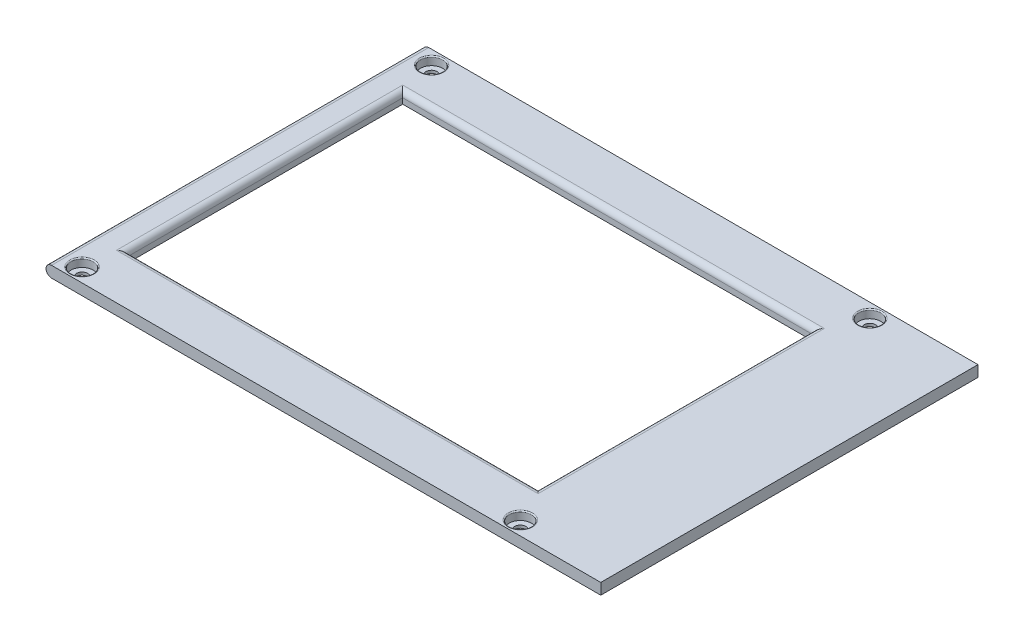
ISO-10303-21;
HEADER;
FILE_DESCRIPTION(('STEP AP214'),'2;1');
FILE_NAME('part.step','',(''),(''),'','','');
FILE_SCHEMA(('AUTOMOTIVE_DESIGN { 1 0 10303 214 1 1 1 1 }'));
ENDSEC;
DATA;
#1=APPLICATION_CONTEXT('core data for automotive mechanical design processes');
#2=APPLICATION_PROTOCOL_DEFINITION('international standard','automotive_design',2000,#1);
#3=PRODUCT_CONTEXT('',#1,'mechanical');
#4=PRODUCT('Part','Part','',(#3));
#5=PRODUCT_RELATED_PRODUCT_CATEGORY('part','',(#4));
#6=PRODUCT_DEFINITION_FORMATION('','',#4);
#7=PRODUCT_DEFINITION_CONTEXT('part definition',#1,'design');
#8=PRODUCT_DEFINITION('design','',#6,#7);
#9=PRODUCT_DEFINITION_SHAPE('','',#8);
#10=(LENGTH_UNIT() NAMED_UNIT(*) SI_UNIT(.MILLI.,.METRE.));
#11=(NAMED_UNIT(*) PLANE_ANGLE_UNIT() SI_UNIT($,.RADIAN.));
#12=(NAMED_UNIT(*) SI_UNIT($,.STERADIAN.) SOLID_ANGLE_UNIT());
#13=UNCERTAINTY_MEASURE_WITH_UNIT(LENGTH_MEASURE(1.E-05),#10,'distance_accuracy_value','');
#14=(GEOMETRIC_REPRESENTATION_CONTEXT(3) GLOBAL_UNCERTAINTY_ASSIGNED_CONTEXT((#13)) GLOBAL_UNIT_ASSIGNED_CONTEXT((#10,
#11,#12)) REPRESENTATION_CONTEXT('',''));
#15=CARTESIAN_POINT('',(0.,0.,0.));
#16=DIRECTION('',(0.,0.,1.));
#17=DIRECTION('',(1.,0.,0.));
#18=AXIS2_PLACEMENT_3D('',#15,#16,#17);
#19=CARTESIAN_POINT('',(33.,0.,-31.5));
#20=DIRECTION('',(0.,1.,0.));
#21=DIRECTION('',(0.,0.,1.));
#22=AXIS2_PLACEMENT_3D('',#19,#20,#21);
#23=CYLINDRICAL_SURFACE('',#22,0.999999999999998);
#24=CARTESIAN_POINT('',(33.,0.,-31.5));
#25=DIRECTION('',(0.,1.,0.));
#26=DIRECTION('',(0.,0.,-1.));
#27=AXIS2_PLACEMENT_3D('',#24,#25,#26);
#28=CIRCLE('',#27,0.999999999999998);
#29=CARTESIAN_POINT('',(33.,0.,-32.5));
#30=VERTEX_POINT('',#29);
#31=EDGE_CURVE('E326',#30,#30,#28,.T.);
#32=ORIENTED_EDGE('',*,*,#31,.F.);
#33=EDGE_LOOP('',(#32));
#34=FACE_BOUND('',#33,.T.);
#35=CARTESIAN_POINT('',(33.,0.5,-31.5));
#36=DIRECTION('',(0.,1.,0.));
#37=DIRECTION('',(0.,0.,1.));
#38=AXIS2_PLACEMENT_3D('',#35,#36,#37);
#39=CIRCLE('',#38,0.999999999999998);
#40=CARTESIAN_POINT('',(33.,0.5,-30.5));
#41=VERTEX_POINT('',#40);
#42=EDGE_CURVE('E303',#41,#41,#39,.F.);
#43=ORIENTED_EDGE('',*,*,#42,.F.);
#44=EDGE_LOOP('',(#43));
#45=FACE_BOUND('',#44,.T.);
#46=ADVANCED_FACE('F35',(#34,#45),#23,.F.);
#47=CARTESIAN_POINT('',(33.,0.,31.5));
#48=DIRECTION('',(0.,1.,0.));
#49=DIRECTION('',(0.,0.,1.));
#50=AXIS2_PLACEMENT_3D('',#47,#48,#49);
#51=CYLINDRICAL_SURFACE('',#50,0.999999999999998);
#52=CARTESIAN_POINT('',(33.,0.,31.5));
#53=DIRECTION('',(0.,1.,0.));
#54=DIRECTION('',(0.,0.,1.));
#55=AXIS2_PLACEMENT_3D('',#52,#53,#54);
#56=CIRCLE('',#55,0.999999999999998);
#57=CARTESIAN_POINT('',(33.,0.,32.5));
#58=VERTEX_POINT('',#57);
#59=EDGE_CURVE('E323',#58,#58,#56,.T.);
#60=ORIENTED_EDGE('',*,*,#59,.F.);
#61=EDGE_LOOP('',(#60));
#62=FACE_BOUND('',#61,.T.);
#63=CARTESIAN_POINT('',(33.,0.5,31.5));
#64=DIRECTION('',(0.,1.,0.));
#65=DIRECTION('',(0.,0.,1.));
#66=AXIS2_PLACEMENT_3D('',#63,#64,#65);
#67=CIRCLE('',#66,0.999999999999998);
#68=CARTESIAN_POINT('',(33.,0.5,32.5));
#69=VERTEX_POINT('',#68);
#70=EDGE_CURVE('E302',#69,#69,#67,.F.);
#71=ORIENTED_EDGE('',*,*,#70,.F.);
#72=EDGE_LOOP('',(#71));
#73=FACE_BOUND('',#72,.T.);
#74=ADVANCED_FACE('F225',(#62,#73),#51,.F.);
#75=CARTESIAN_POINT('',(-46.,0.,31.5));
#76=DIRECTION('',(0.,1.,0.));
#77=DIRECTION('',(0.,0.,1.));
#78=AXIS2_PLACEMENT_3D('',#75,#76,#77);
#79=CYLINDRICAL_SURFACE('',#78,0.999999999999998);
#80=CARTESIAN_POINT('',(-46.,0.,31.5));
#81=DIRECTION('',(0.,1.,0.));
#82=DIRECTION('',(0.,0.,-1.));
#83=AXIS2_PLACEMENT_3D('',#80,#81,#82);
#84=CIRCLE('',#83,0.999999999999998);
#85=CARTESIAN_POINT('',(-46.,0.,30.5));
#86=VERTEX_POINT('',#85);
#87=EDGE_CURVE('E320',#86,#86,#84,.T.);
#88=ORIENTED_EDGE('',*,*,#87,.F.);
#89=EDGE_LOOP('',(#88));
#90=FACE_BOUND('',#89,.T.);
#91=CARTESIAN_POINT('',(-46.,0.5,31.5));
#92=DIRECTION('',(0.,1.,0.));
#93=DIRECTION('',(0.,0.,1.));
#94=AXIS2_PLACEMENT_3D('',#91,#92,#93);
#95=CIRCLE('',#94,0.999999999999998);
#96=CARTESIAN_POINT('',(-46.,0.5,32.5));
#97=VERTEX_POINT('',#96);
#98=EDGE_CURVE('E315',#97,#97,#95,.F.);
#99=ORIENTED_EDGE('',*,*,#98,.F.);
#100=EDGE_LOOP('',(#99));
#101=FACE_BOUND('',#100,.T.);
#102=ADVANCED_FACE('F231',(#90,#101),#79,.F.);
#103=CARTESIAN_POINT('',(-46.,0.,-31.5));
#104=DIRECTION('',(0.,1.,0.));
#105=DIRECTION('',(0.,0.,1.));
#106=AXIS2_PLACEMENT_3D('',#103,#104,#105);
#107=CYLINDRICAL_SURFACE('',#106,0.999999999999998);
#108=CARTESIAN_POINT('',(-46.,0.,-31.5));
#109=DIRECTION('',(0.,1.,0.));
#110=DIRECTION('',(0.,0.,1.));
#111=AXIS2_PLACEMENT_3D('',#108,#109,#110);
#112=CIRCLE('',#111,0.999999999999998);
#113=CARTESIAN_POINT('',(-46.,0.,-30.5));
#114=VERTEX_POINT('',#113);
#115=EDGE_CURVE('E329',#114,#114,#112,.T.);
#116=ORIENTED_EDGE('',*,*,#115,.F.);
#117=EDGE_LOOP('',(#116));
#118=FACE_BOUND('',#117,.T.);
#119=CARTESIAN_POINT('',(-46.,0.5,-31.5));
#120=DIRECTION('',(0.,1.,0.));
#121=DIRECTION('',(0.,0.,1.));
#122=AXIS2_PLACEMENT_3D('',#119,#120,#121);
#123=CIRCLE('',#122,0.999999999999998);
#124=CARTESIAN_POINT('',(-46.,0.5,-30.5));
#125=VERTEX_POINT('',#124);
#126=EDGE_CURVE('E319',#125,#125,#123,.F.);
#127=ORIENTED_EDGE('',*,*,#126,.F.);
#128=EDGE_LOOP('',(#127));
#129=FACE_BOUND('',#128,.T.);
#130=ADVANCED_FACE('F238',(#118,#129),#107,.F.);
#131=CARTESIAN_POINT('',(50.,2.,34.));
#132=DIRECTION('',(0.,0.,-1.));
#133=DIRECTION('',(-1.,0.,0.));
#134=AXIS2_PLACEMENT_3D('',#131,#132,#133);
#135=PLANE('',#134);
#136=DIRECTION('',(1.,0.,0.));
#137=VECTOR('',#136,1.);
#138=CARTESIAN_POINT('',(50.,2.,34.));
#139=LINE('',#138,#137);
#140=CARTESIAN_POINT('',(-49.,2.,34.));
#141=VERTEX_POINT('',#140);
#142=CARTESIAN_POINT('',(50.,2.,34.));
#143=VERTEX_POINT('',#142);
#144=EDGE_CURVE('E333',#141,#143,#139,.T.);
#145=ORIENTED_EDGE('',*,*,#144,.F.);
#146=CARTESIAN_POINT('',(-49.,1.,34.));
#147=DIRECTION('',(0.,0.,-1.));
#148=DIRECTION('',(-1.,0.,0.));
#149=AXIS2_PLACEMENT_3D('',#146,#147,#148);
#150=CIRCLE('',#149,1.);
#151=CARTESIAN_POINT('',(-50.,1.,34.));
#152=VERTEX_POINT('',#151);
#153=EDGE_CURVE('E158',#141,#152,#150,.F.);
#154=ORIENTED_EDGE('',*,*,#153,.T.);
#155=CARTESIAN_POINT('',(-49.,1.,34.));
#156=DIRECTION('',(0.,0.,-1.));
#157=DIRECTION('',(-1.,0.,0.));
#158=AXIS2_PLACEMENT_3D('',#155,#156,#157);
#159=CIRCLE('',#158,1.);
#160=CARTESIAN_POINT('',(-49.,0.,34.));
#161=VERTEX_POINT('',#160);
#162=EDGE_CURVE('E156',#152,#161,#159,.F.);
#163=ORIENTED_EDGE('',*,*,#162,.T.);
#164=DIRECTION('',(1.,0.,0.));
#165=VECTOR('',#164,1.);
#166=CARTESIAN_POINT('',(50.,0.,34.));
#167=LINE('',#166,#165);
#168=CARTESIAN_POINT('',(50.,0.,34.));
#169=VERTEX_POINT('',#168);
#170=EDGE_CURVE('E332',#161,#169,#167,.T.);
#171=ORIENTED_EDGE('',*,*,#170,.T.);
#172=DIRECTION('',(0.,-1.,0.));
#173=VECTOR('',#172,1.);
#174=CARTESIAN_POINT('',(50.,2.,34.));
#175=LINE('',#174,#173);
#176=EDGE_CURVE('E133',#143,#169,#175,.T.);
#177=ORIENTED_EDGE('',*,*,#176,.F.);
#178=EDGE_LOOP('',(#145,#154,#163,#171,#177));
#179=FACE_BOUND('',#178,.T.);
#180=ADVANCED_FACE('F241',(#179),#135,.F.);
#181=CARTESIAN_POINT('',(50.,2.,34.));
#182=DIRECTION('',(-1.,0.,0.));
#183=DIRECTION('',(0.,0.,1.));
#184=AXIS2_PLACEMENT_3D('',#181,#182,#183);
#185=PLANE('',#184);
#186=DIRECTION('',(0.,0.,-1.));
#187=VECTOR('',#186,1.);
#188=CARTESIAN_POINT('',(50.,0.,34.));
#189=LINE('',#188,#187);
#190=CARTESIAN_POINT('',(50.,0.,-34.));
#191=VERTEX_POINT('',#190);
#192=EDGE_CURVE('E343',#169,#191,#189,.T.);
#193=ORIENTED_EDGE('',*,*,#192,.T.);
#194=DIRECTION('',(0.,-1.,0.));
#195=VECTOR('',#194,1.);
#196=CARTESIAN_POINT('',(50.,2.,-34.));
#197=LINE('',#196,#195);
#198=CARTESIAN_POINT('',(50.,2.,-34.));
#199=VERTEX_POINT('',#198);
#200=EDGE_CURVE('E341',#199,#191,#197,.T.);
#201=ORIENTED_EDGE('',*,*,#200,.F.);
#202=DIRECTION('',(0.,0.,-1.));
#203=VECTOR('',#202,1.);
#204=CARTESIAN_POINT('',(50.,2.,34.));
#205=LINE('',#204,#203);
#206=EDGE_CURVE('E335',#143,#199,#205,.T.);
#207=ORIENTED_EDGE('',*,*,#206,.F.);
#208=ORIENTED_EDGE('',*,*,#176,.T.);
#209=EDGE_LOOP('',(#193,#201,#207,#208));
#210=FACE_BOUND('',#209,.T.);
#211=ADVANCED_FACE('F253',(#210),#185,.F.);
#212=CARTESIAN_POINT('',(50.,2.,-34.));
#213=DIRECTION('',(0.,0.,1.));
#214=DIRECTION('',(1.,0.,0.));
#215=AXIS2_PLACEMENT_3D('',#212,#213,#214);
#216=PLANE('',#215);
#217=CARTESIAN_POINT('',(-49.,1.,-34.));
#218=DIRECTION('',(0.,0.,1.));
#219=DIRECTION('',(1.,0.,0.));
#220=AXIS2_PLACEMENT_3D('',#217,#218,#219);
#221=CIRCLE('',#220,1.);
#222=CARTESIAN_POINT('',(-49.,0.,-34.));
#223=VERTEX_POINT('',#222);
#224=CARTESIAN_POINT('',(-50.,1.,-34.));
#225=VERTEX_POINT('',#224);
#226=EDGE_CURVE('E160',#223,#225,#221,.F.);
#227=ORIENTED_EDGE('',*,*,#226,.T.);
#228=CARTESIAN_POINT('',(-49.,1.,-34.));
#229=DIRECTION('',(0.,0.,1.));
#230=DIRECTION('',(1.,0.,0.));
#231=AXIS2_PLACEMENT_3D('',#228,#229,#230);
#232=CIRCLE('',#231,1.);
#233=CARTESIAN_POINT('',(-49.,2.,-34.));
#234=VERTEX_POINT('',#233);
#235=EDGE_CURVE('E162',#225,#234,#232,.F.);
#236=ORIENTED_EDGE('',*,*,#235,.T.);
#237=DIRECTION('',(-1.,0.,0.));
#238=VECTOR('',#237,1.);
#239=CARTESIAN_POINT('',(50.,2.,-34.));
#240=LINE('',#239,#238);
#241=EDGE_CURVE('E338',#199,#234,#240,.T.);
#242=ORIENTED_EDGE('',*,*,#241,.F.);
#243=ORIENTED_EDGE('',*,*,#200,.T.);
#244=DIRECTION('',(-1.,0.,0.));
#245=VECTOR('',#244,1.);
#246=CARTESIAN_POINT('',(50.,0.,-34.));
#247=LINE('',#246,#245);
#248=EDGE_CURVE('E336',#191,#223,#247,.T.);
#249=ORIENTED_EDGE('',*,*,#248,.T.);
#250=EDGE_LOOP('',(#227,#236,#242,#243,#249));
#251=FACE_BOUND('',#250,.T.);
#252=ADVANCED_FACE('F246',(#251),#216,.F.);
#253=CARTESIAN_POINT('',(0.,2.,0.));
#254=DIRECTION('',(0.,1.,0.));
#255=DIRECTION('',(0.,0.,1.));
#256=AXIS2_PLACEMENT_3D('',#253,#254,#255);
#257=PLANE('',#256);
#258=CARTESIAN_POINT('',(33.,2.,31.5));
#259=DIRECTION('',(0.,1.,0.));
#260=DIRECTION('',(0.,0.,1.));
#261=AXIS2_PLACEMENT_3D('',#258,#259,#260);
#262=CIRCLE('',#261,2.2);
#263=CARTESIAN_POINT('',(33.,2.,33.7));
#264=VERTEX_POINT('',#263);
#265=EDGE_CURVE('E200',#264,#264,#262,.F.);
#266=ORIENTED_EDGE('',*,*,#265,.T.);
#267=EDGE_LOOP('',(#266));
#268=FACE_BOUND('',#267,.T.);
#269=CARTESIAN_POINT('',(33.,2.,-31.5));
#270=DIRECTION('',(0.,1.,0.));
#271=DIRECTION('',(0.,0.,1.));
#272=AXIS2_PLACEMENT_3D('',#269,#270,#271);
#273=CIRCLE('',#272,2.2);
#274=CARTESIAN_POINT('',(33.,2.,-29.3));
#275=VERTEX_POINT('',#274);
#276=EDGE_CURVE('E197',#275,#275,#273,.F.);
#277=ORIENTED_EDGE('',*,*,#276,.T.);
#278=EDGE_LOOP('',(#277));
#279=FACE_BOUND('',#278,.T.);
#280=CARTESIAN_POINT('',(-46.,2.,-31.5));
#281=DIRECTION('',(0.,1.,0.));
#282=DIRECTION('',(0.,0.,1.));
#283=AXIS2_PLACEMENT_3D('',#280,#281,#282);
#284=CIRCLE('',#283,2.2);
#285=CARTESIAN_POINT('',(-46.,2.,-29.3));
#286=VERTEX_POINT('',#285);
#287=EDGE_CURVE('E194',#286,#286,#284,.F.);
#288=ORIENTED_EDGE('',*,*,#287,.T.);
#289=EDGE_LOOP('',(#288));
#290=FACE_BOUND('',#289,.T.);
#291=CARTESIAN_POINT('',(-46.,2.,31.5));
#292=DIRECTION('',(0.,1.,0.));
#293=DIRECTION('',(0.,0.,1.));
#294=AXIS2_PLACEMENT_3D('',#291,#292,#293);
#295=CIRCLE('',#294,2.2);
#296=CARTESIAN_POINT('',(-46.,2.,33.7));
#297=VERTEX_POINT('',#296);
#298=EDGE_CURVE('E191',#297,#297,#295,.F.);
#299=ORIENTED_EDGE('',*,*,#298,.T.);
#300=EDGE_LOOP('',(#299));
#301=FACE_BOUND('',#300,.T.);
#302=DIRECTION('',(0.,0.,1.));
#303=VECTOR('',#302,1.);
#304=CARTESIAN_POINT('',(-45.5,2.,-25.8));
#305=LINE('',#304,#303);
#306=CARTESIAN_POINT('',(-45.5,2.,25.8));
#307=VERTEX_POINT('',#306);
#308=CARTESIAN_POINT('',(-45.5,2.,-25.8));
#309=VERTEX_POINT('',#308);
#310=EDGE_CURVE('E176',#307,#309,#305,.F.);
#311=ORIENTED_EDGE('',*,*,#310,.T.);
#312=DIRECTION('',(-1.,0.,0.));
#313=VECTOR('',#312,1.);
#314=CARTESIAN_POINT('',(29.5,2.,-25.8));
#315=LINE('',#314,#313);
#316=CARTESIAN_POINT('',(30.5,2.,-25.8));
#317=VERTEX_POINT('',#316);
#318=EDGE_CURVE('E58',#309,#317,#315,.F.);
#319=ORIENTED_EDGE('',*,*,#318,.T.);
#320=DIRECTION('',(0.,0.,-1.));
#321=VECTOR('',#320,1.);
#322=CARTESIAN_POINT('',(30.5,2.,24.8));
#323=LINE('',#322,#321);
#324=CARTESIAN_POINT('',(30.5,2.,25.8));
#325=VERTEX_POINT('',#324);
#326=EDGE_CURVE('E172',#317,#325,#323,.F.);
#327=ORIENTED_EDGE('',*,*,#326,.T.);
#328=DIRECTION('',(1.,0.,0.));
#329=VECTOR('',#328,1.);
#330=CARTESIAN_POINT('',(-44.5,2.,25.8));
#331=LINE('',#330,#329);
#332=EDGE_CURVE('E174',#325,#307,#331,.F.);
#333=ORIENTED_EDGE('',*,*,#332,.T.);
#334=EDGE_LOOP('',(#311,#319,#327,#333));
#335=FACE_BOUND('',#334,.T.);
#336=ORIENTED_EDGE('',*,*,#241,.T.);
#337=DIRECTION('',(0.,0.,1.));
#338=VECTOR('',#337,1.);
#339=CARTESIAN_POINT('',(-49.,2.,34.));
#340=LINE('',#339,#338);
#341=EDGE_CURVE('E148',#234,#141,#340,.T.);
#342=ORIENTED_EDGE('',*,*,#341,.T.);
#343=ORIENTED_EDGE('',*,*,#144,.T.);
#344=ORIENTED_EDGE('',*,*,#206,.T.);
#345=EDGE_LOOP('',(#336,#342,#343,#344));
#346=FACE_BOUND('',#345,.T.);
#347=ADVANCED_FACE('F243',(#268,#279,#290,#301,#335,#346),#257,.T.);
#348=CARTESIAN_POINT('',(0.,0.,0.));
#349=DIRECTION('',(0.,1.,0.));
#350=DIRECTION('',(0.,0.,1.));
#351=AXIS2_PLACEMENT_3D('',#348,#349,#350);
#352=PLANE('',#351);
#353=DIRECTION('',(1.,0.,0.));
#354=VECTOR('',#353,1.);
#355=CARTESIAN_POINT('',(0.,0.,24.8));
#356=LINE('',#355,#354);
#357=CARTESIAN_POINT('',(-44.5,0.,24.8));
#358=VERTEX_POINT('',#357);
#359=CARTESIAN_POINT('',(29.5,0.,24.8));
#360=VERTEX_POINT('',#359);
#361=EDGE_CURVE('E145',#358,#360,#356,.T.);
#362=ORIENTED_EDGE('',*,*,#361,.T.);
#363=DIRECTION('',(0.,0.,-1.));
#364=VECTOR('',#363,1.);
#365=CARTESIAN_POINT('',(29.5,0.,0.));
#366=LINE('',#365,#364);
#367=CARTESIAN_POINT('',(29.5,0.,-24.8));
#368=VERTEX_POINT('',#367);
#369=EDGE_CURVE('E137',#360,#368,#366,.T.);
#370=ORIENTED_EDGE('',*,*,#369,.T.);
#371=DIRECTION('',(-1.,0.,0.));
#372=VECTOR('',#371,1.);
#373=CARTESIAN_POINT('',(0.,0.,-24.8));
#374=LINE('',#373,#372);
#375=CARTESIAN_POINT('',(-44.5,0.,-24.8));
#376=VERTEX_POINT('',#375);
#377=EDGE_CURVE('E120',#368,#376,#374,.T.);
#378=ORIENTED_EDGE('',*,*,#377,.T.);
#379=DIRECTION('',(0.,0.,1.));
#380=VECTOR('',#379,1.);
#381=CARTESIAN_POINT('',(-44.5,0.,0.));
#382=LINE('',#381,#380);
#383=EDGE_CURVE('E132',#376,#358,#382,.T.);
#384=ORIENTED_EDGE('',*,*,#383,.T.);
#385=EDGE_LOOP('',(#362,#370,#378,#384));
#386=FACE_BOUND('',#385,.T.);
#387=ORIENTED_EDGE('',*,*,#87,.T.);
#388=EDGE_LOOP('',(#387));
#389=FACE_BOUND('',#388,.T.);
#390=ORIENTED_EDGE('',*,*,#59,.T.);
#391=EDGE_LOOP('',(#390));
#392=FACE_BOUND('',#391,.T.);
#393=ORIENTED_EDGE('',*,*,#31,.T.);
#394=EDGE_LOOP('',(#393));
#395=FACE_BOUND('',#394,.T.);
#396=ORIENTED_EDGE('',*,*,#115,.T.);
#397=EDGE_LOOP('',(#396));
#398=FACE_BOUND('',#397,.T.);
#399=ORIENTED_EDGE('',*,*,#170,.F.);
#400=DIRECTION('',(0.,0.,1.));
#401=VECTOR('',#400,1.);
#402=CARTESIAN_POINT('',(-49.,0.,0.));
#403=LINE('',#402,#401);
#404=EDGE_CURVE('E164',#161,#223,#403,.F.);
#405=ORIENTED_EDGE('',*,*,#404,.T.);
#406=ORIENTED_EDGE('',*,*,#248,.F.);
#407=ORIENTED_EDGE('',*,*,#192,.F.);
#408=EDGE_LOOP('',(#399,#405,#406,#407));
#409=FACE_BOUND('',#408,.T.);
#410=ADVANCED_FACE('F143',(#386,#389,#392,#395,#398,#409),#352,.F.);
#411=CARTESIAN_POINT('',(-46.,0.5,-31.5));
#412=DIRECTION('',(0.,1.,0.));
#413=DIRECTION('',(0.,0.,1.));
#414=AXIS2_PLACEMENT_3D('',#411,#412,#413);
#415=PLANE('',#414);
#416=CARTESIAN_POINT('',(-46.,0.5,-31.5));
#417=DIRECTION('',(0.,1.,0.));
#418=DIRECTION('',(0.,0.,1.));
#419=AXIS2_PLACEMENT_3D('',#416,#417,#418);
#420=CIRCLE('',#419,2.);
#421=CARTESIAN_POINT('',(-46.,0.5,-29.5));
#422=VERTEX_POINT('',#421);
#423=EDGE_CURVE('E316',#422,#422,#420,.T.);
#424=ORIENTED_EDGE('',*,*,#423,.T.);
#425=EDGE_LOOP('',(#424));
#426=FACE_BOUND('',#425,.T.);
#427=ORIENTED_EDGE('',*,*,#126,.T.);
#428=EDGE_LOOP('',(#427));
#429=FACE_BOUND('',#428,.T.);
#430=ADVANCED_FACE('F250',(#426,#429),#415,.T.);
#431=CARTESIAN_POINT('',(-46.,0.5,-31.5));
#432=DIRECTION('',(0.,1.,0.));
#433=DIRECTION('',(0.,0.,1.));
#434=AXIS2_PLACEMENT_3D('',#431,#432,#433);
#435=CYLINDRICAL_SURFACE('',#434,2.);
#436=CARTESIAN_POINT('',(-46.,1.8,-31.5));
#437=DIRECTION('',(0.,1.,0.));
#438=DIRECTION('',(0.,0.,1.));
#439=AXIS2_PLACEMENT_3D('',#436,#437,#438);
#440=CIRCLE('',#439,2.);
#441=CARTESIAN_POINT('',(-46.,1.8,-29.5));
#442=VERTEX_POINT('',#441);
#443=EDGE_CURVE('E43',#442,#442,#440,.T.);
#444=ORIENTED_EDGE('',*,*,#443,.T.);
#445=EDGE_LOOP('',(#444));
#446=FACE_BOUND('',#445,.T.);
#447=ORIENTED_EDGE('',*,*,#423,.F.);
#448=EDGE_LOOP('',(#447));
#449=FACE_BOUND('',#448,.T.);
#450=ADVANCED_FACE('F208',(#446,#449),#435,.F.);
#451=CARTESIAN_POINT('',(-46.,0.5,31.5));
#452=DIRECTION('',(0.,1.,0.));
#453=DIRECTION('',(0.,0.,1.));
#454=AXIS2_PLACEMENT_3D('',#451,#452,#453);
#455=PLANE('',#454);
#456=CARTESIAN_POINT('',(-46.,0.5,31.5));
#457=DIRECTION('',(0.,1.,0.));
#458=DIRECTION('',(0.,0.,1.));
#459=AXIS2_PLACEMENT_3D('',#456,#457,#458);
#460=CIRCLE('',#459,2.);
#461=CARTESIAN_POINT('',(-46.,0.5,33.5));
#462=VERTEX_POINT('',#461);
#463=EDGE_CURVE('E306',#462,#462,#460,.T.);
#464=ORIENTED_EDGE('',*,*,#463,.T.);
#465=EDGE_LOOP('',(#464));
#466=FACE_BOUND('',#465,.T.);
#467=ORIENTED_EDGE('',*,*,#98,.T.);
#468=EDGE_LOOP('',(#467));
#469=FACE_BOUND('',#468,.T.);
#470=ADVANCED_FACE('F383',(#466,#469),#455,.T.);
#471=CARTESIAN_POINT('',(-46.,0.5,31.5));
#472=DIRECTION('',(0.,1.,0.));
#473=DIRECTION('',(0.,0.,1.));
#474=AXIS2_PLACEMENT_3D('',#471,#472,#473);
#475=CYLINDRICAL_SURFACE('',#474,2.);
#476=CARTESIAN_POINT('',(-46.,1.8,31.5));
#477=DIRECTION('',(0.,1.,0.));
#478=DIRECTION('',(0.,0.,1.));
#479=AXIS2_PLACEMENT_3D('',#476,#477,#478);
#480=CIRCLE('',#479,2.);
#481=CARTESIAN_POINT('',(-46.,1.8,33.5));
#482=VERTEX_POINT('',#481);
#483=EDGE_CURVE('E11',#482,#482,#480,.T.);
#484=ORIENTED_EDGE('',*,*,#483,.T.);
#485=EDGE_LOOP('',(#484));
#486=FACE_BOUND('',#485,.T.);
#487=ORIENTED_EDGE('',*,*,#463,.F.);
#488=EDGE_LOOP('',(#487));
#489=FACE_BOUND('',#488,.T.);
#490=ADVANCED_FACE('F381',(#486,#489),#475,.F.);
#491=CARTESIAN_POINT('',(33.,0.5,31.5));
#492=DIRECTION('',(0.,1.,0.));
#493=DIRECTION('',(0.,0.,1.));
#494=AXIS2_PLACEMENT_3D('',#491,#492,#493);
#495=PLANE('',#494);
#496=CARTESIAN_POINT('',(33.,0.5,31.5));
#497=DIRECTION('',(0.,1.,0.));
#498=DIRECTION('',(0.,0.,1.));
#499=AXIS2_PLACEMENT_3D('',#496,#497,#498);
#500=CIRCLE('',#499,2.);
#501=CARTESIAN_POINT('',(33.,0.5,33.5));
#502=VERTEX_POINT('',#501);
#503=EDGE_CURVE('E300',#502,#502,#500,.T.);
#504=ORIENTED_EDGE('',*,*,#503,.T.);
#505=EDGE_LOOP('',(#504));
#506=FACE_BOUND('',#505,.T.);
#507=ORIENTED_EDGE('',*,*,#70,.T.);
#508=EDGE_LOOP('',(#507));
#509=FACE_BOUND('',#508,.T.);
#510=ADVANCED_FACE('F296',(#506,#509),#495,.T.);
#511=CARTESIAN_POINT('',(33.,0.5,31.5));
#512=DIRECTION('',(0.,1.,0.));
#513=DIRECTION('',(0.,0.,1.));
#514=AXIS2_PLACEMENT_3D('',#511,#512,#513);
#515=CYLINDRICAL_SURFACE('',#514,2.);
#516=CARTESIAN_POINT('',(33.,1.8,31.5));
#517=DIRECTION('',(0.,1.,0.));
#518=DIRECTION('',(0.,0.,1.));
#519=AXIS2_PLACEMENT_3D('',#516,#517,#518);
#520=CIRCLE('',#519,2.);
#521=CARTESIAN_POINT('',(33.,1.8,33.5));
#522=VERTEX_POINT('',#521);
#523=EDGE_CURVE('E184',#522,#522,#520,.T.);
#524=ORIENTED_EDGE('',*,*,#523,.T.);
#525=EDGE_LOOP('',(#524));
#526=FACE_BOUND('',#525,.T.);
#527=ORIENTED_EDGE('',*,*,#503,.F.);
#528=EDGE_LOOP('',(#527));
#529=FACE_BOUND('',#528,.T.);
#530=ADVANCED_FACE('F292',(#526,#529),#515,.F.);
#531=CARTESIAN_POINT('',(33.,0.5,-31.5));
#532=DIRECTION('',(0.,1.,0.));
#533=DIRECTION('',(0.,0.,1.));
#534=AXIS2_PLACEMENT_3D('',#531,#532,#533);
#535=PLANE('',#534);
#536=CARTESIAN_POINT('',(33.,0.5,-31.5));
#537=DIRECTION('',(0.,1.,0.));
#538=DIRECTION('',(0.,0.,1.));
#539=AXIS2_PLACEMENT_3D('',#536,#537,#538);
#540=CIRCLE('',#539,2.);
#541=CARTESIAN_POINT('',(33.,0.5,-29.5));
#542=VERTEX_POINT('',#541);
#543=EDGE_CURVE('E309',#542,#542,#540,.T.);
#544=ORIENTED_EDGE('',*,*,#543,.T.);
#545=EDGE_LOOP('',(#544));
#546=FACE_BOUND('',#545,.T.);
#547=ORIENTED_EDGE('',*,*,#42,.T.);
#548=EDGE_LOOP('',(#547));
#549=FACE_BOUND('',#548,.T.);
#550=ADVANCED_FACE('F295',(#546,#549),#535,.T.);
#551=CARTESIAN_POINT('',(33.,0.5,-31.5));
#552=DIRECTION('',(0.,1.,0.));
#553=DIRECTION('',(0.,0.,1.));
#554=AXIS2_PLACEMENT_3D('',#551,#552,#553);
#555=CYLINDRICAL_SURFACE('',#554,2.);
#556=CARTESIAN_POINT('',(33.,1.8,-31.5));
#557=DIRECTION('',(0.,1.,0.));
#558=DIRECTION('',(0.,0.,1.));
#559=AXIS2_PLACEMENT_3D('',#556,#557,#558);
#560=CIRCLE('',#559,2.);
#561=CARTESIAN_POINT('',(33.,1.8,-29.5));
#562=VERTEX_POINT('',#561);
#563=EDGE_CURVE('E203',#562,#562,#560,.T.);
#564=ORIENTED_EDGE('',*,*,#563,.T.);
#565=EDGE_LOOP('',(#564));
#566=FACE_BOUND('',#565,.T.);
#567=ORIENTED_EDGE('',*,*,#543,.F.);
#568=EDGE_LOOP('',(#567));
#569=FACE_BOUND('',#568,.T.);
#570=ADVANCED_FACE('F368',(#566,#569),#555,.F.);
#571=CARTESIAN_POINT('',(29.5,-3.,-24.8));
#572=DIRECTION('',(1.,0.,0.));
#573=DIRECTION('',(0.,0.,-1.));
#574=AXIS2_PLACEMENT_3D('',#571,#572,#573);
#575=PLANE('',#574);
#576=DIRECTION('',(0.,1.,0.));
#577=VECTOR('',#576,1.);
#578=CARTESIAN_POINT('',(29.5,-3.,24.8));
#579=LINE('',#578,#577);
#580=CARTESIAN_POINT('',(29.5,1.,24.8));
#581=VERTEX_POINT('',#580);
#582=EDGE_CURVE('E359',#360,#581,#579,.T.);
#583=ORIENTED_EDGE('',*,*,#582,.T.);
#584=DIRECTION('',(0.,0.,-1.));
#585=VECTOR('',#584,1.);
#586=CARTESIAN_POINT('',(29.5,1.,-25.8));
#587=LINE('',#586,#585);
#588=CARTESIAN_POINT('',(29.5,1.,-24.8));
#589=VERTEX_POINT('',#588);
#590=EDGE_CURVE('E139',#581,#589,#587,.T.);
#591=ORIENTED_EDGE('',*,*,#590,.T.);
#592=DIRECTION('',(0.,1.,0.));
#593=VECTOR('',#592,1.);
#594=CARTESIAN_POINT('',(29.5,-3.,-24.8));
#595=LINE('',#594,#593);
#596=EDGE_CURVE('E124',#368,#589,#595,.T.);
#597=ORIENTED_EDGE('',*,*,#596,.F.);
#598=ORIENTED_EDGE('',*,*,#369,.F.);
#599=EDGE_LOOP('',(#583,#591,#597,#598));
#600=FACE_BOUND('',#599,.T.);
#601=ADVANCED_FACE('F136',(#600),#575,.F.);
#602=CARTESIAN_POINT('',(-44.5,-3.,24.8));
#603=DIRECTION('',(0.,0.,1.));
#604=DIRECTION('',(1.,0.,0.));
#605=AXIS2_PLACEMENT_3D('',#602,#603,#604);
#606=PLANE('',#605);
#607=DIRECTION('',(0.,1.,0.));
#608=VECTOR('',#607,1.);
#609=CARTESIAN_POINT('',(-44.5,-3.,24.8));
#610=LINE('',#609,#608);
#611=CARTESIAN_POINT('',(-44.5,1.,24.8));
#612=VERTEX_POINT('',#611);
#613=EDGE_CURVE('E358',#358,#612,#610,.T.);
#614=ORIENTED_EDGE('',*,*,#613,.T.);
#615=DIRECTION('',(1.,0.,0.));
#616=VECTOR('',#615,1.);
#617=CARTESIAN_POINT('',(29.5,1.,24.8));
#618=LINE('',#617,#616);
#619=EDGE_CURVE('E50',#612,#581,#618,.T.);
#620=ORIENTED_EDGE('',*,*,#619,.T.);
#621=ORIENTED_EDGE('',*,*,#582,.F.);
#622=ORIENTED_EDGE('',*,*,#361,.F.);
#623=EDGE_LOOP('',(#614,#620,#621,#622));
#624=FACE_BOUND('',#623,.T.);
#625=ADVANCED_FACE('F375',(#624),#606,.F.);
#626=CARTESIAN_POINT('',(-44.5,-3.,-24.8));
#627=DIRECTION('',(-1.,0.,0.));
#628=DIRECTION('',(0.,0.,1.));
#629=AXIS2_PLACEMENT_3D('',#626,#627,#628);
#630=PLANE('',#629);
#631=DIRECTION('',(0.,1.,0.));
#632=VECTOR('',#631,1.);
#633=CARTESIAN_POINT('',(-44.5,-3.,-24.8));
#634=LINE('',#633,#632);
#635=CARTESIAN_POINT('',(-44.5,1.,-24.8));
#636=VERTEX_POINT('',#635);
#637=EDGE_CURVE('E127',#376,#636,#634,.T.);
#638=ORIENTED_EDGE('',*,*,#637,.T.);
#639=DIRECTION('',(0.,0.,1.));
#640=VECTOR('',#639,1.);
#641=CARTESIAN_POINT('',(-44.5,1.,24.8));
#642=LINE('',#641,#640);
#643=EDGE_CURVE('E166',#636,#612,#642,.T.);
#644=ORIENTED_EDGE('',*,*,#643,.T.);
#645=ORIENTED_EDGE('',*,*,#613,.F.);
#646=ORIENTED_EDGE('',*,*,#383,.F.);
#647=EDGE_LOOP('',(#638,#644,#645,#646));
#648=FACE_BOUND('',#647,.T.);
#649=ADVANCED_FACE('F356',(#648),#630,.F.);
#650=CARTESIAN_POINT('',(-44.5,-3.,-24.8));
#651=DIRECTION('',(0.,0.,-1.));
#652=DIRECTION('',(-1.,0.,0.));
#653=AXIS2_PLACEMENT_3D('',#650,#651,#652);
#654=PLANE('',#653);
#655=ORIENTED_EDGE('',*,*,#596,.T.);
#656=DIRECTION('',(-1.,0.,0.));
#657=VECTOR('',#656,1.);
#658=CARTESIAN_POINT('',(-44.5,1.,-24.8));
#659=LINE('',#658,#657);
#660=EDGE_CURVE('E146',#589,#636,#659,.T.);
#661=ORIENTED_EDGE('',*,*,#660,.T.);
#662=ORIENTED_EDGE('',*,*,#637,.F.);
#663=ORIENTED_EDGE('',*,*,#377,.F.);
#664=EDGE_LOOP('',(#655,#661,#662,#663));
#665=FACE_BOUND('',#664,.T.);
#666=ADVANCED_FACE('F122',(#665),#654,.F.);
#667=CARTESIAN_POINT('',(-44.5,1.,-25.8));
#668=DIRECTION('',(1.,0.,0.));
#669=DIRECTION('',(0.,0.,-1.));
#670=AXIS2_PLACEMENT_3D('',#667,#668,#669);
#671=CYLINDRICAL_SURFACE('',#670,1.);
#672=ORIENTED_EDGE('',*,*,#660,.F.);
#673=CARTESIAN_POINT('',(30.5,1.,-25.8));
#674=DIRECTION('',(0.707106781186547,0.,0.707106781186547));
#675=DIRECTION('',(-0.707106781186547,0.,0.707106781186547));
#676=AXIS2_PLACEMENT_3D('',#673,#674,#675);
#677=ELLIPSE('',#676,1.41421356237309,1.);
#678=EDGE_CURVE('E182',#589,#317,#677,.F.);
#679=ORIENTED_EDGE('',*,*,#678,.T.);
#680=ORIENTED_EDGE('',*,*,#318,.F.);
#681=CARTESIAN_POINT('',(-45.5,1.,-25.8));
#682=DIRECTION('',(0.707106781186547,0.,-0.707106781186547));
#683=DIRECTION('',(-0.707106781186547,0.,-0.707106781186547));
#684=AXIS2_PLACEMENT_3D('',#681,#682,#683);
#685=ELLIPSE('',#684,1.41421356237309,1.);
#686=EDGE_CURVE('E180',#309,#636,#685,.T.);
#687=ORIENTED_EDGE('',*,*,#686,.T.);
#688=EDGE_LOOP('',(#672,#679,#680,#687));
#689=FACE_BOUND('',#688,.T.);
#690=ADVANCED_FACE('F261',(#689),#671,.T.);
#691=CARTESIAN_POINT('',(-49.,1.,34.));
#692=DIRECTION('',(0.,0.,1.));
#693=DIRECTION('',(1.,0.,0.));
#694=AXIS2_PLACEMENT_3D('',#691,#692,#693);
#695=CYLINDRICAL_SURFACE('',#694,1.);
#696=DIRECTION('',(0.,0.,1.));
#697=VECTOR('',#696,1.);
#698=CARTESIAN_POINT('',(-50.,1.,34.));
#699=LINE('',#698,#697);
#700=EDGE_CURVE('E140',#225,#152,#699,.T.);
#701=ORIENTED_EDGE('',*,*,#700,.F.);
#702=ORIENTED_EDGE('',*,*,#226,.F.);
#703=ORIENTED_EDGE('',*,*,#404,.F.);
#704=ORIENTED_EDGE('',*,*,#162,.F.);
#705=EDGE_LOOP('',(#701,#702,#703,#704));
#706=FACE_BOUND('',#705,.T.);
#707=ADVANCED_FACE('F264',(#706),#695,.T.);
#708=CARTESIAN_POINT('',(-49.,1.,0.));
#709=DIRECTION('',(0.,0.,-1.));
#710=DIRECTION('',(-1.,0.,0.));
#711=AXIS2_PLACEMENT_3D('',#708,#709,#710);
#712=CYLINDRICAL_SURFACE('',#711,1.);
#713=ORIENTED_EDGE('',*,*,#235,.F.);
#714=ORIENTED_EDGE('',*,*,#700,.T.);
#715=ORIENTED_EDGE('',*,*,#153,.F.);
#716=ORIENTED_EDGE('',*,*,#341,.F.);
#717=EDGE_LOOP('',(#713,#714,#715,#716));
#718=FACE_BOUND('',#717,.T.);
#719=ADVANCED_FACE('F265',(#718),#712,.T.);
#720=CARTESIAN_POINT('',(30.5,1.,-24.8));
#721=DIRECTION('',(0.,0.,1.));
#722=DIRECTION('',(1.,0.,0.));
#723=AXIS2_PLACEMENT_3D('',#720,#721,#722);
#724=CYLINDRICAL_SURFACE('',#723,1.);
#725=ORIENTED_EDGE('',*,*,#678,.F.);
#726=ORIENTED_EDGE('',*,*,#590,.F.);
#727=CARTESIAN_POINT('',(30.5,1.,25.8));
#728=DIRECTION('',(-0.707106781186547,0.,0.707106781186547));
#729=DIRECTION('',(-0.707106781186547,0.,-0.707106781186547));
#730=AXIS2_PLACEMENT_3D('',#727,#728,#729);
#731=ELLIPSE('',#730,1.41421356237309,1.);
#732=EDGE_CURVE('E169',#325,#581,#731,.T.);
#733=ORIENTED_EDGE('',*,*,#732,.F.);
#734=ORIENTED_EDGE('',*,*,#326,.F.);
#735=EDGE_LOOP('',(#725,#726,#733,#734));
#736=FACE_BOUND('',#735,.T.);
#737=ADVANCED_FACE('F268',(#736),#724,.T.);
#738=CARTESIAN_POINT('',(-44.5,1.,25.8));
#739=DIRECTION('',(-1.,0.,0.));
#740=DIRECTION('',(0.,0.,1.));
#741=AXIS2_PLACEMENT_3D('',#738,#739,#740);
#742=CYLINDRICAL_SURFACE('',#741,1.);
#743=ORIENTED_EDGE('',*,*,#732,.T.);
#744=ORIENTED_EDGE('',*,*,#619,.F.);
#745=CARTESIAN_POINT('',(-45.5,1.,25.8));
#746=DIRECTION('',(-0.707106781186547,0.,-0.707106781186547));
#747=DIRECTION('',(0.707106781186547,0.,-0.707106781186547));
#748=AXIS2_PLACEMENT_3D('',#745,#746,#747);
#749=ELLIPSE('',#748,1.41421356237309,1.);
#750=EDGE_CURVE('E185',#307,#612,#749,.T.);
#751=ORIENTED_EDGE('',*,*,#750,.F.);
#752=ORIENTED_EDGE('',*,*,#332,.F.);
#753=EDGE_LOOP('',(#743,#744,#751,#752));
#754=FACE_BOUND('',#753,.T.);
#755=ADVANCED_FACE('F276',(#754),#742,.T.);
#756=CARTESIAN_POINT('',(-45.5,1.,-24.8));
#757=DIRECTION('',(0.,0.,-1.));
#758=DIRECTION('',(-1.,0.,0.));
#759=AXIS2_PLACEMENT_3D('',#756,#757,#758);
#760=CYLINDRICAL_SURFACE('',#759,1.);
#761=ORIENTED_EDGE('',*,*,#686,.F.);
#762=ORIENTED_EDGE('',*,*,#310,.F.);
#763=ORIENTED_EDGE('',*,*,#750,.T.);
#764=ORIENTED_EDGE('',*,*,#643,.F.);
#765=EDGE_LOOP('',(#761,#762,#763,#764));
#766=FACE_BOUND('',#765,.T.);
#767=ADVANCED_FACE('F273',(#766),#760,.T.);
#768=CARTESIAN_POINT('',(33.,1.8,31.5));
#769=DIRECTION('',(0.,1.,0.));
#770=DIRECTION('',(0.,0.,1.));
#771=AXIS2_PLACEMENT_3D('',#768,#769,#770);
#772=TOROIDAL_SURFACE('',#771,2.2,0.2);
#773=ORIENTED_EDGE('',*,*,#265,.F.);
#774=EDGE_LOOP('',(#773));
#775=FACE_BOUND('',#774,.T.);
#776=ORIENTED_EDGE('',*,*,#523,.F.);
#777=EDGE_LOOP('',(#776));
#778=FACE_BOUND('',#777,.T.);
#779=ADVANCED_FACE('F220',(#775,#778),#772,.T.);
#780=CARTESIAN_POINT('',(33.,1.8,-31.5));
#781=DIRECTION('',(0.,1.,0.));
#782=DIRECTION('',(0.,0.,1.));
#783=AXIS2_PLACEMENT_3D('',#780,#781,#782);
#784=TOROIDAL_SURFACE('',#783,2.2,0.2);
#785=ORIENTED_EDGE('',*,*,#276,.F.);
#786=EDGE_LOOP('',(#785));
#787=FACE_BOUND('',#786,.T.);
#788=ORIENTED_EDGE('',*,*,#563,.F.);
#789=EDGE_LOOP('',(#788));
#790=FACE_BOUND('',#789,.T.);
#791=ADVANCED_FACE('F213',(#787,#790),#784,.T.);
#792=CARTESIAN_POINT('',(-46.,1.8,-31.5));
#793=DIRECTION('',(0.,1.,0.));
#794=DIRECTION('',(0.,0.,1.));
#795=AXIS2_PLACEMENT_3D('',#792,#793,#794);
#796=TOROIDAL_SURFACE('',#795,2.2,0.2);
#797=ORIENTED_EDGE('',*,*,#287,.F.);
#798=EDGE_LOOP('',(#797));
#799=FACE_BOUND('',#798,.T.);
#800=ORIENTED_EDGE('',*,*,#443,.F.);
#801=EDGE_LOOP('',(#800));
#802=FACE_BOUND('',#801,.T.);
#803=ADVANCED_FACE('F211',(#799,#802),#796,.T.);
#804=CARTESIAN_POINT('',(-46.,1.8,31.5));
#805=DIRECTION('',(0.,1.,0.));
#806=DIRECTION('',(0.,0.,1.));
#807=AXIS2_PLACEMENT_3D('',#804,#805,#806);
#808=TOROIDAL_SURFACE('',#807,2.2,0.2);
#809=ORIENTED_EDGE('',*,*,#298,.F.);
#810=EDGE_LOOP('',(#809));
#811=FACE_BOUND('',#810,.T.);
#812=ORIENTED_EDGE('',*,*,#483,.F.);
#813=EDGE_LOOP('',(#812));
#814=FACE_BOUND('',#813,.T.);
#815=ADVANCED_FACE('F37',(#811,#814),#808,.T.);
#816=CLOSED_SHELL('',(#46,#74,#102,#130,#180,#211,#252,#347,#410,#430,#450,#470,#490,#510,#530,
#550,#570,#601,#625,#649,#666,#690,#707,#719,#737,#755,#767,#779,#791,#803,#815));
#817=MANIFOLD_SOLID_BREP('B2',#816);
#818=ADVANCED_BREP_SHAPE_REPRESENTATION('',(#18,#817),#14);
#819=SHAPE_DEFINITION_REPRESENTATION(#9,#818);
ENDSEC;
END-ISO-10303-21;
